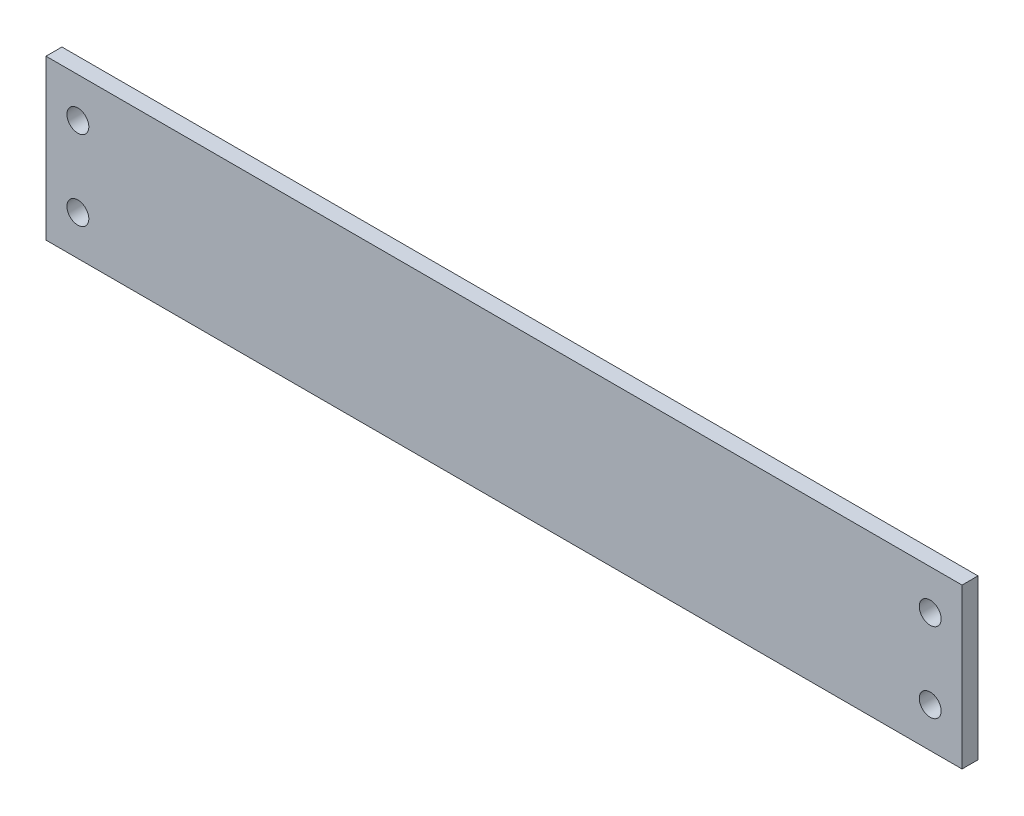
ISO-10303-21;
HEADER;
FILE_DESCRIPTION(('STEP AP214'),'2;1');
FILE_NAME('part.step','',(''),(''),'','','');
FILE_SCHEMA(('AUTOMOTIVE_DESIGN { 1 0 10303 214 1 1 1 1 }'));
ENDSEC;
DATA;
#1=APPLICATION_CONTEXT('core data for automotive mechanical design processes');
#2=APPLICATION_PROTOCOL_DEFINITION('international standard','automotive_design',2000,#1);
#3=PRODUCT_CONTEXT('',#1,'mechanical');
#4=PRODUCT('Part','Part','',(#3));
#5=PRODUCT_RELATED_PRODUCT_CATEGORY('part','',(#4));
#6=PRODUCT_DEFINITION_FORMATION('','',#4);
#7=PRODUCT_DEFINITION_CONTEXT('part definition',#1,'design');
#8=PRODUCT_DEFINITION('design','',#6,#7);
#9=PRODUCT_DEFINITION_SHAPE('','',#8);
#10=(LENGTH_UNIT() NAMED_UNIT(*) SI_UNIT(.MILLI.,.METRE.));
#11=(NAMED_UNIT(*) PLANE_ANGLE_UNIT() SI_UNIT($,.RADIAN.));
#12=(NAMED_UNIT(*) SI_UNIT($,.STERADIAN.) SOLID_ANGLE_UNIT());
#13=UNCERTAINTY_MEASURE_WITH_UNIT(LENGTH_MEASURE(1.E-05),#10,'distance_accuracy_value','');
#14=(GEOMETRIC_REPRESENTATION_CONTEXT(3) GLOBAL_UNCERTAINTY_ASSIGNED_CONTEXT((#13)) GLOBAL_UNIT_ASSIGNED_CONTEXT((#10,
#11,#12)) REPRESENTATION_CONTEXT('',''));
#15=CARTESIAN_POINT('',(0.,0.,0.));
#16=DIRECTION('',(0.,0.,1.));
#17=DIRECTION('',(1.,0.,0.));
#18=AXIS2_PLACEMENT_3D('',#15,#16,#17);
#19=CARTESIAN_POINT('',(0.,40.,-4.));
#20=DIRECTION('',(0.,1.,0.));
#21=DIRECTION('',(-1.,0.,0.));
#22=AXIS2_PLACEMENT_3D('',#19,#20,#21);
#23=PLANE('',#22);
#24=DIRECTION('',(-1.,0.,0.));
#25=VECTOR('',#24,1.);
#26=CARTESIAN_POINT('',(0.,40.,0.));
#27=LINE('',#26,#25);
#28=CARTESIAN_POINT('',(230.,40.,0.));
#29=VERTEX_POINT('',#28);
#30=CARTESIAN_POINT('',(0.,40.,0.));
#31=VERTEX_POINT('',#30);
#32=EDGE_CURVE('E99',#29,#31,#27,.T.);
#33=ORIENTED_EDGE('',*,*,#32,.F.);
#34=DIRECTION('',(0.,0.,1.));
#35=VECTOR('',#34,1.);
#36=CARTESIAN_POINT('',(230.,40.,-4.));
#37=LINE('',#36,#35);
#38=CARTESIAN_POINT('',(230.,40.,-4.));
#39=VERTEX_POINT('',#38);
#40=EDGE_CURVE('E11',#39,#29,#37,.T.);
#41=ORIENTED_EDGE('',*,*,#40,.F.);
#42=DIRECTION('',(-1.,0.,0.));
#43=VECTOR('',#42,1.);
#44=CARTESIAN_POINT('',(0.,40.,-4.));
#45=LINE('',#44,#43);
#46=CARTESIAN_POINT('',(0.,40.,-4.));
#47=VERTEX_POINT('',#46);
#48=EDGE_CURVE('E92',#39,#47,#45,.T.);
#49=ORIENTED_EDGE('',*,*,#48,.T.);
#50=DIRECTION('',(0.,0.,1.));
#51=VECTOR('',#50,1.);
#52=CARTESIAN_POINT('',(0.,40.,-4.));
#53=LINE('',#52,#51);
#54=EDGE_CURVE('E37',#47,#31,#53,.T.);
#55=ORIENTED_EDGE('',*,*,#54,.T.);
#56=EDGE_LOOP('',(#33,#41,#49,#55));
#57=FACE_BOUND('',#56,.T.);
#58=ADVANCED_FACE('F34',(#57),#23,.T.);
#59=CARTESIAN_POINT('',(230.,40.,-4.));
#60=DIRECTION('',(1.,0.,0.));
#61=DIRECTION('',(0.,0.,-1.));
#62=AXIS2_PLACEMENT_3D('',#59,#60,#61);
#63=PLANE('',#62);
#64=DIRECTION('',(0.,1.,0.));
#65=VECTOR('',#64,1.);
#66=CARTESIAN_POINT('',(230.,40.,0.));
#67=LINE('',#66,#65);
#68=CARTESIAN_POINT('',(230.,0.,0.));
#69=VERTEX_POINT('',#68);
#70=EDGE_CURVE('E94',#69,#29,#67,.T.);
#71=ORIENTED_EDGE('',*,*,#70,.F.);
#72=DIRECTION('',(0.,0.,1.));
#73=VECTOR('',#72,1.);
#74=CARTESIAN_POINT('',(230.,0.,-4.));
#75=LINE('',#74,#73);
#76=CARTESIAN_POINT('',(230.,0.,-4.));
#77=VERTEX_POINT('',#76);
#78=EDGE_CURVE('E43',#77,#69,#75,.T.);
#79=ORIENTED_EDGE('',*,*,#78,.F.);
#80=DIRECTION('',(0.,1.,0.));
#81=VECTOR('',#80,1.);
#82=CARTESIAN_POINT('',(230.,40.,-4.));
#83=LINE('',#82,#81);
#84=EDGE_CURVE('E89',#77,#39,#83,.T.);
#85=ORIENTED_EDGE('',*,*,#84,.T.);
#86=ORIENTED_EDGE('',*,*,#40,.T.);
#87=EDGE_LOOP('',(#71,#79,#85,#86));
#88=FACE_BOUND('',#87,.T.);
#89=ADVANCED_FACE('F110',(#88),#63,.T.);
#90=CARTESIAN_POINT('',(0.,0.,-4.));
#91=DIRECTION('',(0.,-1.,0.));
#92=DIRECTION('',(0.,0.,-1.));
#93=AXIS2_PLACEMENT_3D('',#90,#91,#92);
#94=PLANE('',#93);
#95=DIRECTION('',(1.,0.,0.));
#96=VECTOR('',#95,1.);
#97=CARTESIAN_POINT('',(0.,0.,0.));
#98=LINE('',#97,#96);
#99=CARTESIAN_POINT('',(0.,0.,0.));
#100=VERTEX_POINT('',#99);
#101=EDGE_CURVE('E84',#100,#69,#98,.T.);
#102=ORIENTED_EDGE('',*,*,#101,.F.);
#103=DIRECTION('',(0.,0.,1.));
#104=VECTOR('',#103,1.);
#105=CARTESIAN_POINT('',(0.,0.,-4.));
#106=LINE('',#105,#104);
#107=CARTESIAN_POINT('',(0.,0.,-4.));
#108=VERTEX_POINT('',#107);
#109=EDGE_CURVE('E79',#108,#100,#106,.T.);
#110=ORIENTED_EDGE('',*,*,#109,.F.);
#111=DIRECTION('',(1.,0.,0.));
#112=VECTOR('',#111,1.);
#113=CARTESIAN_POINT('',(0.,0.,-4.));
#114=LINE('',#113,#112);
#115=EDGE_CURVE('E82',#108,#77,#114,.T.);
#116=ORIENTED_EDGE('',*,*,#115,.T.);
#117=ORIENTED_EDGE('',*,*,#78,.T.);
#118=EDGE_LOOP('',(#102,#110,#116,#117));
#119=FACE_BOUND('',#118,.T.);
#120=ADVANCED_FACE('F81',(#119),#94,.T.);
#121=CARTESIAN_POINT('',(0.,40.,-4.));
#122=DIRECTION('',(-1.,0.,0.));
#123=DIRECTION('',(0.,-1.,0.));
#124=AXIS2_PLACEMENT_3D('',#121,#122,#123);
#125=PLANE('',#124);
#126=DIRECTION('',(0.,-1.,0.));
#127=VECTOR('',#126,1.);
#128=CARTESIAN_POINT('',(0.,40.,0.));
#129=LINE('',#128,#127);
#130=EDGE_CURVE('E102',#31,#100,#129,.T.);
#131=ORIENTED_EDGE('',*,*,#130,.F.);
#132=ORIENTED_EDGE('',*,*,#54,.F.);
#133=DIRECTION('',(0.,-1.,0.));
#134=VECTOR('',#133,1.);
#135=CARTESIAN_POINT('',(0.,40.,-4.));
#136=LINE('',#135,#134);
#137=EDGE_CURVE('E88',#47,#108,#136,.T.);
#138=ORIENTED_EDGE('',*,*,#137,.T.);
#139=ORIENTED_EDGE('',*,*,#109,.T.);
#140=EDGE_LOOP('',(#131,#132,#138,#139));
#141=FACE_BOUND('',#140,.T.);
#142=ADVANCED_FACE('F91',(#141),#125,.T.);
#143=CARTESIAN_POINT('',(0.,0.,-4.));
#144=DIRECTION('',(0.,0.,-1.));
#145=DIRECTION('',(-1.,0.,0.));
#146=AXIS2_PLACEMENT_3D('',#143,#144,#145);
#147=PLANE('',#146);
#148=CARTESIAN_POINT('',(222.,30.,-4.));
#149=DIRECTION('',(0.,0.,-1.));
#150=DIRECTION('',(-1.,0.,0.));
#151=AXIS2_PLACEMENT_3D('',#148,#149,#150);
#152=CIRCLE('',#151,2.75);
#153=CARTESIAN_POINT('',(219.25,30.,-4.));
#154=VERTEX_POINT('',#153);
#155=EDGE_CURVE('E154',#154,#154,#152,.T.);
#156=ORIENTED_EDGE('',*,*,#155,.F.);
#157=EDGE_LOOP('',(#156));
#158=FACE_BOUND('',#157,.T.);
#159=CARTESIAN_POINT('',(222.,10.,-4.));
#160=DIRECTION('',(0.,0.,-1.));
#161=DIRECTION('',(-1.,0.,0.));
#162=AXIS2_PLACEMENT_3D('',#159,#160,#161);
#163=CIRCLE('',#162,2.75);
#164=CARTESIAN_POINT('',(219.25,10.,-4.));
#165=VERTEX_POINT('',#164);
#166=EDGE_CURVE('E156',#165,#165,#163,.T.);
#167=ORIENTED_EDGE('',*,*,#166,.F.);
#168=EDGE_LOOP('',(#167));
#169=FACE_BOUND('',#168,.T.);
#170=CARTESIAN_POINT('',(8.00000000000004,30.,-4.));
#171=DIRECTION('',(0.,0.,-1.));
#172=DIRECTION('',(-1.,0.,0.));
#173=AXIS2_PLACEMENT_3D('',#170,#171,#172);
#174=CIRCLE('',#173,2.75);
#175=CARTESIAN_POINT('',(5.25000000000004,30.,-4.));
#176=VERTEX_POINT('',#175);
#177=EDGE_CURVE('E164',#176,#176,#174,.T.);
#178=ORIENTED_EDGE('',*,*,#177,.F.);
#179=EDGE_LOOP('',(#178));
#180=FACE_BOUND('',#179,.T.);
#181=CARTESIAN_POINT('',(8.00000000000004,10.,-4.));
#182=DIRECTION('',(0.,0.,-1.));
#183=DIRECTION('',(-1.,0.,0.));
#184=AXIS2_PLACEMENT_3D('',#181,#182,#183);
#185=CIRCLE('',#184,2.75);
#186=CARTESIAN_POINT('',(5.25000000000004,10.,-4.));
#187=VERTEX_POINT('',#186);
#188=EDGE_CURVE('E170',#187,#187,#185,.T.);
#189=ORIENTED_EDGE('',*,*,#188,.F.);
#190=EDGE_LOOP('',(#189));
#191=FACE_BOUND('',#190,.T.);
#192=ORIENTED_EDGE('',*,*,#48,.F.);
#193=ORIENTED_EDGE('',*,*,#84,.F.);
#194=ORIENTED_EDGE('',*,*,#115,.F.);
#195=ORIENTED_EDGE('',*,*,#137,.F.);
#196=EDGE_LOOP('',(#192,#193,#194,#195));
#197=FACE_BOUND('',#196,.T.);
#198=ADVANCED_FACE('F87',(#158,#169,#180,#191,#197),#147,.T.);
#199=CARTESIAN_POINT('',(0.,0.,0.));
#200=DIRECTION('',(0.,0.,-1.));
#201=DIRECTION('',(-1.,0.,0.));
#202=AXIS2_PLACEMENT_3D('',#199,#200,#201);
#203=PLANE('',#202);
#204=CARTESIAN_POINT('',(222.,30.,0.));
#205=DIRECTION('',(0.,0.,-1.));
#206=DIRECTION('',(-1.,0.,0.));
#207=AXIS2_PLACEMENT_3D('',#204,#205,#206);
#208=CIRCLE('',#207,2.75);
#209=CARTESIAN_POINT('',(219.25,30.,0.));
#210=VERTEX_POINT('',#209);
#211=EDGE_CURVE('E152',#210,#210,#208,.T.);
#212=ORIENTED_EDGE('',*,*,#211,.T.);
#213=EDGE_LOOP('',(#212));
#214=FACE_BOUND('',#213,.T.);
#215=CARTESIAN_POINT('',(222.,10.,0.));
#216=DIRECTION('',(0.,0.,-1.));
#217=DIRECTION('',(-1.,0.,0.));
#218=AXIS2_PLACEMENT_3D('',#215,#216,#217);
#219=CIRCLE('',#218,2.75);
#220=CARTESIAN_POINT('',(219.25,10.,0.));
#221=VERTEX_POINT('',#220);
#222=EDGE_CURVE('E161',#221,#221,#219,.T.);
#223=ORIENTED_EDGE('',*,*,#222,.T.);
#224=EDGE_LOOP('',(#223));
#225=FACE_BOUND('',#224,.T.);
#226=CARTESIAN_POINT('',(8.00000000000004,30.,0.));
#227=DIRECTION('',(0.,0.,-1.));
#228=DIRECTION('',(-1.,0.,0.));
#229=AXIS2_PLACEMENT_3D('',#226,#227,#228);
#230=CIRCLE('',#229,2.75);
#231=CARTESIAN_POINT('',(5.25000000000004,30.,0.));
#232=VERTEX_POINT('',#231);
#233=EDGE_CURVE('E167',#232,#232,#230,.T.);
#234=ORIENTED_EDGE('',*,*,#233,.T.);
#235=EDGE_LOOP('',(#234));
#236=FACE_BOUND('',#235,.T.);
#237=CARTESIAN_POINT('',(8.00000000000004,10.,0.));
#238=DIRECTION('',(0.,0.,-1.));
#239=DIRECTION('',(-1.,0.,0.));
#240=AXIS2_PLACEMENT_3D('',#237,#238,#239);
#241=CIRCLE('',#240,2.75);
#242=CARTESIAN_POINT('',(5.25000000000004,10.,0.));
#243=VERTEX_POINT('',#242);
#244=EDGE_CURVE('E103',#243,#243,#241,.T.);
#245=ORIENTED_EDGE('',*,*,#244,.T.);
#246=EDGE_LOOP('',(#245));
#247=FACE_BOUND('',#246,.T.);
#248=ORIENTED_EDGE('',*,*,#32,.T.);
#249=ORIENTED_EDGE('',*,*,#130,.T.);
#250=ORIENTED_EDGE('',*,*,#101,.T.);
#251=ORIENTED_EDGE('',*,*,#70,.T.);
#252=EDGE_LOOP('',(#248,#249,#250,#251));
#253=FACE_BOUND('',#252,.T.);
#254=ADVANCED_FACE('F109',(#214,#225,#236,#247,#253),#203,.F.);
#255=CARTESIAN_POINT('',(8.00000000000004,10.,-4.));
#256=DIRECTION('',(0.,0.,-1.));
#257=DIRECTION('',(-1.,0.,0.));
#258=AXIS2_PLACEMENT_3D('',#255,#256,#257);
#259=CYLINDRICAL_SURFACE('',#258,2.75);
#260=ORIENTED_EDGE('',*,*,#244,.F.);
#261=EDGE_LOOP('',(#260));
#262=FACE_BOUND('',#261,.T.);
#263=ORIENTED_EDGE('',*,*,#188,.T.);
#264=EDGE_LOOP('',(#263));
#265=FACE_BOUND('',#264,.T.);
#266=ADVANCED_FACE('F128',(#262,#265),#259,.F.);
#267=CARTESIAN_POINT('',(8.00000000000004,30.,-4.));
#268=DIRECTION('',(0.,0.,-1.));
#269=DIRECTION('',(-1.,0.,0.));
#270=AXIS2_PLACEMENT_3D('',#267,#268,#269);
#271=CYLINDRICAL_SURFACE('',#270,2.75);
#272=ORIENTED_EDGE('',*,*,#233,.F.);
#273=EDGE_LOOP('',(#272));
#274=FACE_BOUND('',#273,.T.);
#275=ORIENTED_EDGE('',*,*,#177,.T.);
#276=EDGE_LOOP('',(#275));
#277=FACE_BOUND('',#276,.T.);
#278=ADVANCED_FACE('F135',(#274,#277),#271,.F.);
#279=CARTESIAN_POINT('',(222.,10.,-4.));
#280=DIRECTION('',(0.,0.,-1.));
#281=DIRECTION('',(-1.,0.,0.));
#282=AXIS2_PLACEMENT_3D('',#279,#280,#281);
#283=CYLINDRICAL_SURFACE('',#282,2.75);
#284=ORIENTED_EDGE('',*,*,#222,.F.);
#285=EDGE_LOOP('',(#284));
#286=FACE_BOUND('',#285,.T.);
#287=ORIENTED_EDGE('',*,*,#166,.T.);
#288=EDGE_LOOP('',(#287));
#289=FACE_BOUND('',#288,.T.);
#290=ADVANCED_FACE('F139',(#286,#289),#283,.F.);
#291=CARTESIAN_POINT('',(222.,30.,-4.));
#292=DIRECTION('',(0.,0.,-1.));
#293=DIRECTION('',(-1.,0.,0.));
#294=AXIS2_PLACEMENT_3D('',#291,#292,#293);
#295=CYLINDRICAL_SURFACE('',#294,2.75);
#296=ORIENTED_EDGE('',*,*,#211,.F.);
#297=EDGE_LOOP('',(#296));
#298=FACE_BOUND('',#297,.T.);
#299=ORIENTED_EDGE('',*,*,#155,.T.);
#300=EDGE_LOOP('',(#299));
#301=FACE_BOUND('',#300,.T.);
#302=ADVANCED_FACE('F143',(#298,#301),#295,.F.);
#303=CLOSED_SHELL('',(#58,#89,#120,#142,#198,#254,#266,#278,#290,#302));
#304=MANIFOLD_SOLID_BREP('B2',#303);
#305=ADVANCED_BREP_SHAPE_REPRESENTATION('',(#18,#304),#14);
#306=SHAPE_DEFINITION_REPRESENTATION(#9,#305);
ENDSEC;
END-ISO-10303-21;
